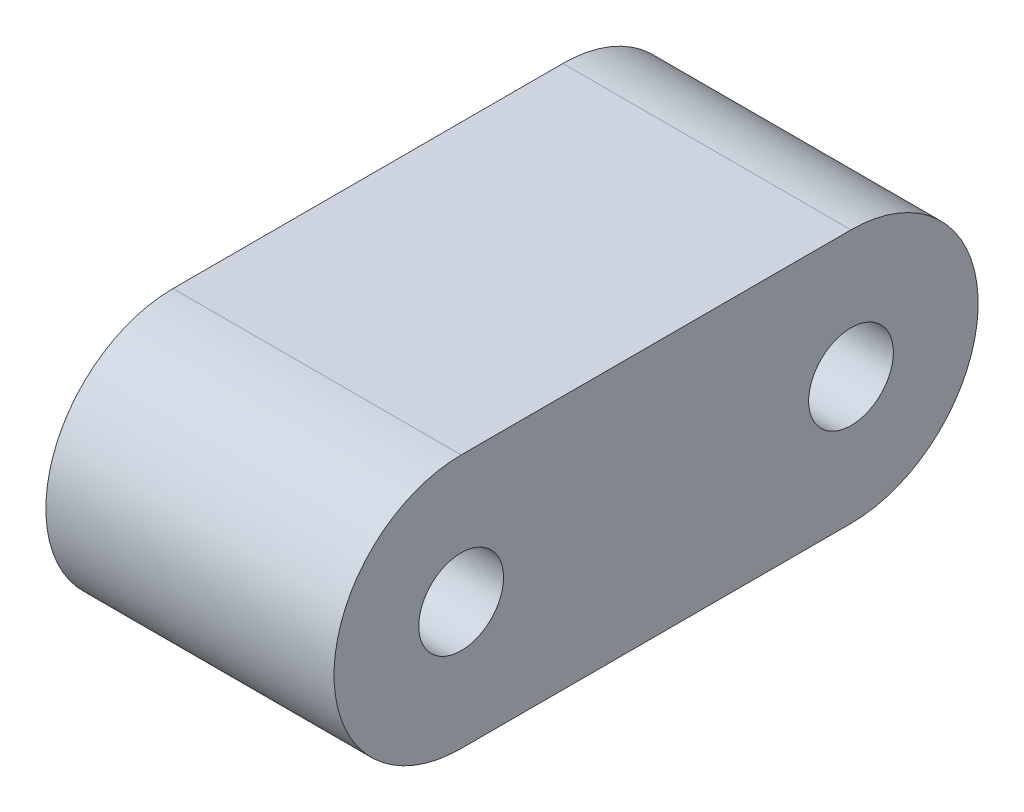
ISO-10303-21;
HEADER;
FILE_DESCRIPTION(('STEP AP214'),'2;1');
FILE_NAME('part.step','',(''),(''),'','','');
FILE_SCHEMA(('AUTOMOTIVE_DESIGN { 1 0 10303 214 1 1 1 1 }'));
ENDSEC;
DATA;
#1=APPLICATION_CONTEXT('core data for automotive mechanical design processes');
#2=APPLICATION_PROTOCOL_DEFINITION('international standard','automotive_design',2000,#1);
#3=PRODUCT_CONTEXT('',#1,'mechanical');
#4=PRODUCT('Part','Part','',(#3));
#5=PRODUCT_RELATED_PRODUCT_CATEGORY('part','',(#4));
#6=PRODUCT_DEFINITION_FORMATION('','',#4);
#7=PRODUCT_DEFINITION_CONTEXT('part definition',#1,'design');
#8=PRODUCT_DEFINITION('design','',#6,#7);
#9=PRODUCT_DEFINITION_SHAPE('','',#8);
#10=(LENGTH_UNIT() NAMED_UNIT(*) SI_UNIT(.MILLI.,.METRE.));
#11=(NAMED_UNIT(*) PLANE_ANGLE_UNIT() SI_UNIT($,.RADIAN.));
#12=(NAMED_UNIT(*) SI_UNIT($,.STERADIAN.) SOLID_ANGLE_UNIT());
#13=UNCERTAINTY_MEASURE_WITH_UNIT(LENGTH_MEASURE(1.E-05),#10,'distance_accuracy_value','');
#14=(GEOMETRIC_REPRESENTATION_CONTEXT(3) GLOBAL_UNCERTAINTY_ASSIGNED_CONTEXT((#13)) GLOBAL_UNIT_ASSIGNED_CONTEXT((#10,
#11,#12)) REPRESENTATION_CONTEXT('',''));
#15=CARTESIAN_POINT('',(0.,0.,0.));
#16=DIRECTION('',(0.,0.,1.));
#17=DIRECTION('',(1.,0.,0.));
#18=AXIS2_PLACEMENT_3D('',#15,#16,#17);
#19=CARTESIAN_POINT('',(8.5,0.,11.5));
#20=DIRECTION('',(1.,0.,0.));
#21=DIRECTION('',(0.,0.,-1.));
#22=AXIS2_PLACEMENT_3D('',#19,#20,#21);
#23=PLANE('',#22);
#24=CARTESIAN_POINT('',(8.5,0.,11.5));
#25=DIRECTION('',(1.,0.,0.));
#26=DIRECTION('',(0.,0.,-1.));
#27=AXIS2_PLACEMENT_3D('',#24,#25,#26);
#28=CIRCLE('',#27,2.5);
#29=CARTESIAN_POINT('',(8.5,0.,9.));
#30=VERTEX_POINT('',#29);
#31=EDGE_CURVE('E100',#30,#30,#28,.T.);
#32=ORIENTED_EDGE('',*,*,#31,.F.);
#33=EDGE_LOOP('',(#32));
#34=FACE_BOUND('',#33,.T.);
#35=CARTESIAN_POINT('',(8.5,0.,11.5));
#36=DIRECTION('',(1.,0.,0.));
#37=DIRECTION('',(0.,0.,-1.));
#38=AXIS2_PLACEMENT_3D('',#35,#36,#37);
#39=CIRCLE('',#38,7.49999999999999);
#40=CARTESIAN_POINT('',(8.5,7.49999999999999,11.5));
#41=VERTEX_POINT('',#40);
#42=CARTESIAN_POINT('',(8.5,-7.5,11.5));
#43=VERTEX_POINT('',#42);
#44=EDGE_CURVE('E85',#41,#43,#39,.T.);
#45=ORIENTED_EDGE('',*,*,#44,.T.);
#46=DIRECTION('',(0.,0.,-1.));
#47=VECTOR('',#46,1.);
#48=CARTESIAN_POINT('',(8.5,-7.5,11.5));
#49=LINE('',#48,#47);
#50=CARTESIAN_POINT('',(8.5,-7.49999999999999,-11.5));
#51=VERTEX_POINT('',#50);
#52=EDGE_CURVE('E80',#43,#51,#49,.T.);
#53=ORIENTED_EDGE('',*,*,#52,.T.);
#54=CARTESIAN_POINT('',(8.5,0.,-11.5));
#55=DIRECTION('',(1.,0.,0.));
#56=DIRECTION('',(0.,0.,-1.));
#57=AXIS2_PLACEMENT_3D('',#54,#55,#56);
#58=CIRCLE('',#57,7.49999999999999);
#59=CARTESIAN_POINT('',(8.5,7.49999999999999,-11.5));
#60=VERTEX_POINT('',#59);
#61=EDGE_CURVE('E83',#51,#60,#58,.T.);
#62=ORIENTED_EDGE('',*,*,#61,.T.);
#63=DIRECTION('',(0.,0.,1.));
#64=VECTOR('',#63,1.);
#65=CARTESIAN_POINT('',(8.5,7.49999999999999,11.5));
#66=LINE('',#65,#64);
#67=EDGE_CURVE('E50',#60,#41,#66,.T.);
#68=ORIENTED_EDGE('',*,*,#67,.T.);
#69=EDGE_LOOP('',(#45,#53,#62,#68));
#70=FACE_BOUND('',#69,.T.);
#71=CARTESIAN_POINT('',(8.5,0.,-11.5));
#72=DIRECTION('',(1.,0.,0.));
#73=DIRECTION('',(0.,0.,-1.));
#74=AXIS2_PLACEMENT_3D('',#71,#72,#73);
#75=CIRCLE('',#74,2.5);
#76=CARTESIAN_POINT('',(8.5,0.,-14.));
#77=VERTEX_POINT('',#76);
#78=EDGE_CURVE('E115',#77,#77,#75,.T.);
#79=ORIENTED_EDGE('',*,*,#78,.F.);
#80=EDGE_LOOP('',(#79));
#81=FACE_BOUND('',#80,.T.);
#82=ADVANCED_FACE('F33',(#34,#70,#81),#23,.T.);
#83=CARTESIAN_POINT('',(-8.5,0.,11.5));
#84=DIRECTION('',(1.,0.,0.));
#85=DIRECTION('',(0.,0.,-1.));
#86=AXIS2_PLACEMENT_3D('',#83,#84,#85);
#87=PLANE('',#86);
#88=CARTESIAN_POINT('',(-8.5,0.,11.5));
#89=DIRECTION('',(1.,0.,0.));
#90=DIRECTION('',(0.,0.,-1.));
#91=AXIS2_PLACEMENT_3D('',#88,#89,#90);
#92=CIRCLE('',#91,7.49999999999999);
#93=CARTESIAN_POINT('',(-8.5,7.49999999999999,11.5));
#94=VERTEX_POINT('',#93);
#95=CARTESIAN_POINT('',(-8.5,-7.5,11.5));
#96=VERTEX_POINT('',#95);
#97=EDGE_CURVE('E97',#94,#96,#92,.T.);
#98=ORIENTED_EDGE('',*,*,#97,.F.);
#99=DIRECTION('',(0.,0.,1.));
#100=VECTOR('',#99,1.);
#101=CARTESIAN_POINT('',(-8.5,7.49999999999999,11.5));
#102=LINE('',#101,#100);
#103=CARTESIAN_POINT('',(-8.5,7.49999999999999,-11.5));
#104=VERTEX_POINT('',#103);
#105=EDGE_CURVE('E73',#104,#94,#102,.T.);
#106=ORIENTED_EDGE('',*,*,#105,.F.);
#107=CARTESIAN_POINT('',(-8.5,0.,-11.5));
#108=DIRECTION('',(1.,0.,0.));
#109=DIRECTION('',(0.,0.,-1.));
#110=AXIS2_PLACEMENT_3D('',#107,#108,#109);
#111=CIRCLE('',#110,7.49999999999999);
#112=CARTESIAN_POINT('',(-8.5,-7.49999999999999,-11.5));
#113=VERTEX_POINT('',#112);
#114=EDGE_CURVE('E67',#113,#104,#111,.T.);
#115=ORIENTED_EDGE('',*,*,#114,.F.);
#116=DIRECTION('',(0.,0.,-1.));
#117=VECTOR('',#116,1.);
#118=CARTESIAN_POINT('',(-8.5,-7.5,11.5));
#119=LINE('',#118,#117);
#120=EDGE_CURVE('E89',#96,#113,#119,.T.);
#121=ORIENTED_EDGE('',*,*,#120,.F.);
#122=EDGE_LOOP('',(#98,#106,#115,#121));
#123=FACE_BOUND('',#122,.T.);
#124=CARTESIAN_POINT('',(-8.5,0.,11.5));
#125=DIRECTION('',(1.,0.,0.));
#126=DIRECTION('',(0.,0.,-1.));
#127=AXIS2_PLACEMENT_3D('',#124,#125,#126);
#128=CIRCLE('',#127,2.5);
#129=CARTESIAN_POINT('',(-8.5,0.,9.));
#130=VERTEX_POINT('',#129);
#131=EDGE_CURVE('E112',#130,#130,#128,.T.);
#132=ORIENTED_EDGE('',*,*,#131,.T.);
#133=EDGE_LOOP('',(#132));
#134=FACE_BOUND('',#133,.T.);
#135=CARTESIAN_POINT('',(-8.5,0.,-11.5));
#136=DIRECTION('',(1.,0.,0.));
#137=DIRECTION('',(0.,0.,-1.));
#138=AXIS2_PLACEMENT_3D('',#135,#136,#137);
#139=CIRCLE('',#138,2.5);
#140=CARTESIAN_POINT('',(-8.5,0.,-14.));
#141=VERTEX_POINT('',#140);
#142=EDGE_CURVE('E118',#141,#141,#139,.T.);
#143=ORIENTED_EDGE('',*,*,#142,.T.);
#144=EDGE_LOOP('',(#143));
#145=FACE_BOUND('',#144,.T.);
#146=ADVANCED_FACE('F108',(#123,#134,#145),#87,.F.);
#147=CARTESIAN_POINT('',(8.5,0.,11.5));
#148=DIRECTION('',(-1.,0.,0.));
#149=DIRECTION('',(0.,0.,1.));
#150=AXIS2_PLACEMENT_3D('',#147,#148,#149);
#151=CYLINDRICAL_SURFACE('',#150,7.49999999999999);
#152=ORIENTED_EDGE('',*,*,#97,.T.);
#153=DIRECTION('',(-1.,0.,0.));
#154=VECTOR('',#153,1.);
#155=CARTESIAN_POINT('',(8.5,-7.5,11.5));
#156=LINE('',#155,#154);
#157=EDGE_CURVE('E11',#43,#96,#156,.T.);
#158=ORIENTED_EDGE('',*,*,#157,.F.);
#159=ORIENTED_EDGE('',*,*,#44,.F.);
#160=DIRECTION('',(-1.,0.,0.));
#161=VECTOR('',#160,1.);
#162=CARTESIAN_POINT('',(8.5,7.49999999999999,11.5));
#163=LINE('',#162,#161);
#164=EDGE_CURVE('E93',#41,#94,#163,.T.);
#165=ORIENTED_EDGE('',*,*,#164,.T.);
#166=EDGE_LOOP('',(#152,#158,#159,#165));
#167=FACE_BOUND('',#166,.T.);
#168=ADVANCED_FACE('F35',(#167),#151,.T.);
#169=CARTESIAN_POINT('',(8.5,-7.5,11.5));
#170=DIRECTION('',(0.,1.,0.));
#171=DIRECTION('',(0.,0.,1.));
#172=AXIS2_PLACEMENT_3D('',#169,#170,#171);
#173=PLANE('',#172);
#174=ORIENTED_EDGE('',*,*,#120,.T.);
#175=DIRECTION('',(-1.,0.,0.));
#176=VECTOR('',#175,1.);
#177=CARTESIAN_POINT('',(8.5,-7.49999999999999,-11.5));
#178=LINE('',#177,#176);
#179=EDGE_CURVE('E42',#51,#113,#178,.T.);
#180=ORIENTED_EDGE('',*,*,#179,.F.);
#181=ORIENTED_EDGE('',*,*,#52,.F.);
#182=ORIENTED_EDGE('',*,*,#157,.T.);
#183=EDGE_LOOP('',(#174,#180,#181,#182));
#184=FACE_BOUND('',#183,.T.);
#185=ADVANCED_FACE('F88',(#184),#173,.F.);
#186=CARTESIAN_POINT('',(8.5,0.,-11.5));
#187=DIRECTION('',(-1.,0.,0.));
#188=DIRECTION('',(0.,0.,1.));
#189=AXIS2_PLACEMENT_3D('',#186,#187,#188);
#190=CYLINDRICAL_SURFACE('',#189,7.49999999999999);
#191=ORIENTED_EDGE('',*,*,#114,.T.);
#192=DIRECTION('',(-1.,0.,0.));
#193=VECTOR('',#192,1.);
#194=CARTESIAN_POINT('',(8.5,7.49999999999999,-11.5));
#195=LINE('',#194,#193);
#196=EDGE_CURVE('E90',#60,#104,#195,.T.);
#197=ORIENTED_EDGE('',*,*,#196,.F.);
#198=ORIENTED_EDGE('',*,*,#61,.F.);
#199=ORIENTED_EDGE('',*,*,#179,.T.);
#200=EDGE_LOOP('',(#191,#197,#198,#199));
#201=FACE_BOUND('',#200,.T.);
#202=ADVANCED_FACE('F91',(#201),#190,.T.);
#203=CARTESIAN_POINT('',(8.5,7.49999999999999,11.5));
#204=DIRECTION('',(0.,-1.,0.));
#205=DIRECTION('',(0.,0.,-1.));
#206=AXIS2_PLACEMENT_3D('',#203,#204,#205);
#207=PLANE('',#206);
#208=ORIENTED_EDGE('',*,*,#105,.T.);
#209=ORIENTED_EDGE('',*,*,#164,.F.);
#210=ORIENTED_EDGE('',*,*,#67,.F.);
#211=ORIENTED_EDGE('',*,*,#196,.T.);
#212=EDGE_LOOP('',(#208,#209,#210,#211));
#213=FACE_BOUND('',#212,.T.);
#214=ADVANCED_FACE('F105',(#213),#207,.F.);
#215=CARTESIAN_POINT('',(8.5,0.,11.5));
#216=DIRECTION('',(-1.,0.,0.));
#217=DIRECTION('',(0.,0.,1.));
#218=AXIS2_PLACEMENT_3D('',#215,#216,#217);
#219=CYLINDRICAL_SURFACE('',#218,2.5);
#220=ORIENTED_EDGE('',*,*,#31,.T.);
#221=EDGE_LOOP('',(#220));
#222=FACE_BOUND('',#221,.T.);
#223=ORIENTED_EDGE('',*,*,#131,.F.);
#224=EDGE_LOOP('',(#223));
#225=FACE_BOUND('',#224,.T.);
#226=ADVANCED_FACE('F135',(#222,#225),#219,.F.);
#227=CARTESIAN_POINT('',(8.5,0.,-11.5));
#228=DIRECTION('',(-1.,0.,0.));
#229=DIRECTION('',(0.,0.,1.));
#230=AXIS2_PLACEMENT_3D('',#227,#228,#229);
#231=CYLINDRICAL_SURFACE('',#230,2.5);
#232=ORIENTED_EDGE('',*,*,#78,.T.);
#233=EDGE_LOOP('',(#232));
#234=FACE_BOUND('',#233,.T.);
#235=ORIENTED_EDGE('',*,*,#142,.F.);
#236=EDGE_LOOP('',(#235));
#237=FACE_BOUND('',#236,.T.);
#238=ADVANCED_FACE('F124',(#234,#237),#231,.F.);
#239=CLOSED_SHELL('',(#82,#146,#168,#185,#202,#214,#226,#238));
#240=MANIFOLD_SOLID_BREP('B2',#239);
#241=ADVANCED_BREP_SHAPE_REPRESENTATION('',(#18,#240),#14);
#242=SHAPE_DEFINITION_REPRESENTATION(#9,#241);
ENDSEC;
END-ISO-10303-21;
